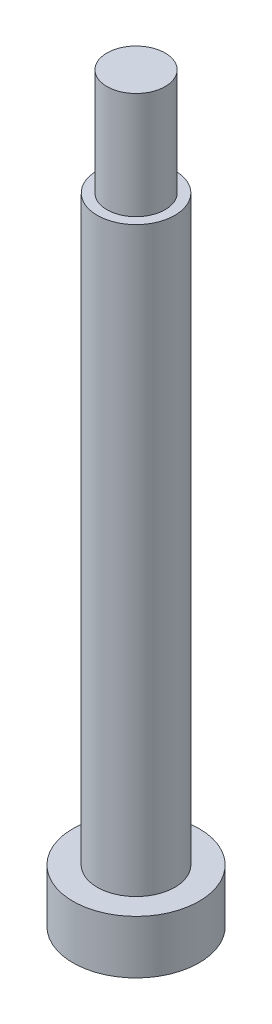
ISO-10303-21;
HEADER;
FILE_DESCRIPTION(('STEP AP214'),'2;1');
FILE_NAME('part.step','',(''),(''),'','','');
FILE_SCHEMA(('AUTOMOTIVE_DESIGN { 1 0 10303 214 1 1 1 1 }'));
ENDSEC;
DATA;
#1=APPLICATION_CONTEXT('core data for automotive mechanical design processes');
#2=APPLICATION_PROTOCOL_DEFINITION('international standard','automotive_design',2000,#1);
#3=PRODUCT_CONTEXT('',#1,'mechanical');
#4=PRODUCT('Part','Part','',(#3));
#5=PRODUCT_RELATED_PRODUCT_CATEGORY('part','',(#4));
#6=PRODUCT_DEFINITION_FORMATION('','',#4);
#7=PRODUCT_DEFINITION_CONTEXT('part definition',#1,'design');
#8=PRODUCT_DEFINITION('design','',#6,#7);
#9=PRODUCT_DEFINITION_SHAPE('','',#8);
#10=(LENGTH_UNIT() NAMED_UNIT(*) SI_UNIT(.MILLI.,.METRE.));
#11=(NAMED_UNIT(*) PLANE_ANGLE_UNIT() SI_UNIT($,.RADIAN.));
#12=(NAMED_UNIT(*) SI_UNIT($,.STERADIAN.) SOLID_ANGLE_UNIT());
#13=UNCERTAINTY_MEASURE_WITH_UNIT(LENGTH_MEASURE(1.E-05),#10,'distance_accuracy_value','');
#14=(GEOMETRIC_REPRESENTATION_CONTEXT(3) GLOBAL_UNCERTAINTY_ASSIGNED_CONTEXT((#13)) GLOBAL_UNIT_ASSIGNED_CONTEXT((#10,
#11,#12)) REPRESENTATION_CONTEXT('',''));
#15=CARTESIAN_POINT('',(0.,0.,0.));
#16=DIRECTION('',(0.,0.,1.));
#17=DIRECTION('',(1.,0.,0.));
#18=AXIS2_PLACEMENT_3D('',#15,#16,#17);
#19=CARTESIAN_POINT('',(0.,60.,0.));
#20=DIRECTION('',(0.,-1.,0.));
#21=DIRECTION('',(0.,0.,-1.));
#22=AXIS2_PLACEMENT_3D('',#19,#20,#21);
#23=CYLINDRICAL_SURFACE('',#22,4.);
#24=CARTESIAN_POINT('',(0.,60.,0.));
#25=DIRECTION('',(0.,1.,0.));
#26=DIRECTION('',(0.,0.,1.));
#27=AXIS2_PLACEMENT_3D('',#24,#25,#26);
#28=CIRCLE('',#27,4.);
#29=CARTESIAN_POINT('',(0.,60.,4.));
#30=VERTEX_POINT('',#29);
#31=EDGE_CURVE('E45',#30,#30,#28,.T.);
#32=ORIENTED_EDGE('',*,*,#31,.F.);
#33=EDGE_LOOP('',(#32));
#34=FACE_BOUND('',#33,.T.);
#35=CARTESIAN_POINT('',(0.,0.,0.));
#36=DIRECTION('',(0.,1.,0.));
#37=DIRECTION('',(0.,0.,1.));
#38=AXIS2_PLACEMENT_3D('',#35,#36,#37);
#39=CIRCLE('',#38,4.);
#40=CARTESIAN_POINT('',(0.,0.,4.));
#41=VERTEX_POINT('',#40);
#42=EDGE_CURVE('E41',#41,#41,#39,.T.);
#43=ORIENTED_EDGE('',*,*,#42,.T.);
#44=EDGE_LOOP('',(#43));
#45=FACE_BOUND('',#44,.T.);
#46=ADVANCED_FACE('F38',(#34,#45),#23,.T.);
#47=CARTESIAN_POINT('',(0.,60.,0.));
#48=DIRECTION('',(0.,1.,0.));
#49=DIRECTION('',(0.,0.,1.));
#50=AXIS2_PLACEMENT_3D('',#47,#48,#49);
#51=PLANE('',#50);
#52=CARTESIAN_POINT('',(0.,60.,0.));
#53=DIRECTION('',(0.,1.,0.));
#54=DIRECTION('',(0.,0.,1.));
#55=AXIS2_PLACEMENT_3D('',#52,#53,#54);
#56=CIRCLE('',#55,3.);
#57=CARTESIAN_POINT('',(0.,60.,3.));
#58=VERTEX_POINT('',#57);
#59=EDGE_CURVE('E10',#58,#58,#56,.T.);
#60=ORIENTED_EDGE('',*,*,#59,.F.);
#61=EDGE_LOOP('',(#60));
#62=FACE_BOUND('',#61,.T.);
#63=ORIENTED_EDGE('',*,*,#31,.T.);
#64=EDGE_LOOP('',(#63));
#65=FACE_BOUND('',#64,.T.);
#66=ADVANCED_FACE('F86',(#62,#65),#51,.T.);
#67=CARTESIAN_POINT('',(0.,71.,0.));
#68=DIRECTION('',(0.,-1.,0.));
#69=DIRECTION('',(0.,0.,-1.));
#70=AXIS2_PLACEMENT_3D('',#67,#68,#69);
#71=CYLINDRICAL_SURFACE('',#70,3.);
#72=CARTESIAN_POINT('',(0.,71.,0.));
#73=DIRECTION('',(0.,1.,0.));
#74=DIRECTION('',(0.,0.,1.));
#75=AXIS2_PLACEMENT_3D('',#72,#73,#74);
#76=CIRCLE('',#75,3.);
#77=CARTESIAN_POINT('',(0.,71.,3.));
#78=VERTEX_POINT('',#77);
#79=EDGE_CURVE('E50',#78,#78,#76,.T.);
#80=ORIENTED_EDGE('',*,*,#79,.F.);
#81=EDGE_LOOP('',(#80));
#82=FACE_BOUND('',#81,.T.);
#83=ORIENTED_EDGE('',*,*,#59,.T.);
#84=EDGE_LOOP('',(#83));
#85=FACE_BOUND('',#84,.T.);
#86=ADVANCED_FACE('F82',(#82,#85),#71,.T.);
#87=CARTESIAN_POINT('',(0.,71.,0.));
#88=DIRECTION('',(0.,1.,0.));
#89=DIRECTION('',(0.,0.,1.));
#90=AXIS2_PLACEMENT_3D('',#87,#88,#89);
#91=PLANE('',#90);
#92=ORIENTED_EDGE('',*,*,#79,.T.);
#93=EDGE_LOOP('',(#92));
#94=FACE_BOUND('',#93,.T.);
#95=ADVANCED_FACE('F74',(#94),#91,.T.);
#96=CARTESIAN_POINT('',(0.,-5.5,0.));
#97=DIRECTION('',(0.,1.,0.));
#98=DIRECTION('',(0.,0.,1.));
#99=AXIS2_PLACEMENT_3D('',#96,#97,#98);
#100=CYLINDRICAL_SURFACE('',#99,6.5);
#101=CARTESIAN_POINT('',(0.,-5.5,0.));
#102=DIRECTION('',(0.,-1.,0.));
#103=DIRECTION('',(0.,0.,-1.));
#104=AXIS2_PLACEMENT_3D('',#101,#102,#103);
#105=CIRCLE('',#104,6.5);
#106=CARTESIAN_POINT('',(0.,-5.5,-6.5));
#107=VERTEX_POINT('',#106);
#108=EDGE_CURVE('E57',#107,#107,#105,.T.);
#109=ORIENTED_EDGE('',*,*,#108,.F.);
#110=EDGE_LOOP('',(#109));
#111=FACE_BOUND('',#110,.T.);
#112=CARTESIAN_POINT('',(0.,0.,0.));
#113=DIRECTION('',(0.,-1.,0.));
#114=DIRECTION('',(0.,0.,-1.));
#115=AXIS2_PLACEMENT_3D('',#112,#113,#114);
#116=CIRCLE('',#115,6.5);
#117=CARTESIAN_POINT('',(0.,0.,-6.5));
#118=VERTEX_POINT('',#117);
#119=EDGE_CURVE('E54',#118,#118,#116,.T.);
#120=ORIENTED_EDGE('',*,*,#119,.T.);
#121=EDGE_LOOP('',(#120));
#122=FACE_BOUND('',#121,.T.);
#123=ADVANCED_FACE('F72',(#111,#122),#100,.T.);
#124=CARTESIAN_POINT('',(0.,-5.5,0.));
#125=DIRECTION('',(0.,-1.,0.));
#126=DIRECTION('',(0.,0.,-1.));
#127=AXIS2_PLACEMENT_3D('',#124,#125,#126);
#128=PLANE('',#127);
#129=ORIENTED_EDGE('',*,*,#108,.T.);
#130=EDGE_LOOP('',(#129));
#131=FACE_BOUND('',#130,.T.);
#132=ADVANCED_FACE('F68',(#131),#128,.T.);
#133=CARTESIAN_POINT('',(0.,0.,0.));
#134=DIRECTION('',(0.,-1.,0.));
#135=DIRECTION('',(0.,0.,-1.));
#136=AXIS2_PLACEMENT_3D('',#133,#134,#135);
#137=PLANE('',#136);
#138=ORIENTED_EDGE('',*,*,#42,.F.);
#139=EDGE_LOOP('',(#138));
#140=FACE_BOUND('',#139,.T.);
#141=ORIENTED_EDGE('',*,*,#119,.F.);
#142=EDGE_LOOP('',(#141));
#143=FACE_BOUND('',#142,.T.);
#144=ADVANCED_FACE('F65',(#140,#143),#137,.F.);
#145=CLOSED_SHELL('',(#46,#66,#86,#95,#123,#132,#144));
#146=MANIFOLD_SOLID_BREP('B2',#145);
#147=ADVANCED_BREP_SHAPE_REPRESENTATION('',(#18,#146),#14);
#148=SHAPE_DEFINITION_REPRESENTATION(#9,#147);
ENDSEC;
END-ISO-10303-21;
